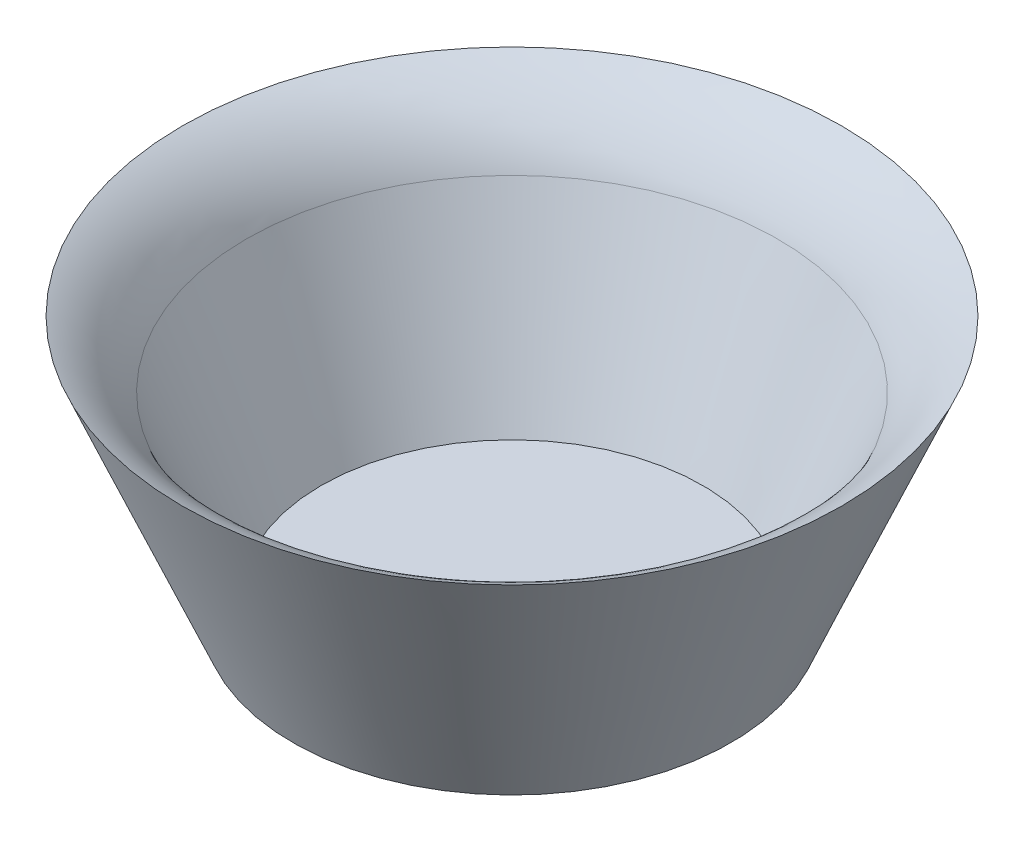
ISO-10303-21;
HEADER;
FILE_DESCRIPTION(('STEP AP214'),'2;1');
FILE_NAME('part.step','',(''),(''),'','','');
FILE_SCHEMA(('AUTOMOTIVE_DESIGN { 1 0 10303 214 1 1 1 1 }'));
ENDSEC;
DATA;
#1=APPLICATION_CONTEXT('core data for automotive mechanical design processes');
#2=APPLICATION_PROTOCOL_DEFINITION('international standard','automotive_design',2000,#1);
#3=PRODUCT_CONTEXT('',#1,'mechanical');
#4=PRODUCT('Part','Part','',(#3));
#5=PRODUCT_RELATED_PRODUCT_CATEGORY('part','',(#4));
#6=PRODUCT_DEFINITION_FORMATION('','',#4);
#7=PRODUCT_DEFINITION_CONTEXT('part definition',#1,'design');
#8=PRODUCT_DEFINITION('design','',#6,#7);
#9=PRODUCT_DEFINITION_SHAPE('','',#8);
#10=(LENGTH_UNIT() NAMED_UNIT(*) SI_UNIT(.MILLI.,.METRE.));
#11=(NAMED_UNIT(*) PLANE_ANGLE_UNIT() SI_UNIT($,.RADIAN.));
#12=(NAMED_UNIT(*) SI_UNIT($,.STERADIAN.) SOLID_ANGLE_UNIT());
#13=UNCERTAINTY_MEASURE_WITH_UNIT(LENGTH_MEASURE(1.E-05),#10,'distance_accuracy_value','');
#14=(GEOMETRIC_REPRESENTATION_CONTEXT(3) GLOBAL_UNCERTAINTY_ASSIGNED_CONTEXT((#13)) GLOBAL_UNIT_ASSIGNED_CONTEXT((#10,
#11,#12)) REPRESENTATION_CONTEXT('',''));
#15=CARTESIAN_POINT('',(0.,0.,0.));
#16=DIRECTION('',(0.,0.,1.));
#17=DIRECTION('',(1.,0.,0.));
#18=AXIS2_PLACEMENT_3D('',#15,#16,#17);
#19=CARTESIAN_POINT('',(-37.4243194035992,0.,0.));
#20=DIRECTION('',(0.,1.,0.));
#21=DIRECTION('',(-1.,0.,0.));
#22=AXIS2_PLACEMENT_3D('',#19,#20,#21);
#23=PLANE('',#22);
#24=CARTESIAN_POINT('',(0.,0.,0.));
#25=DIRECTION('',(0.,1.,0.));
#26=DIRECTION('',(-1.,0.,0.));
#27=AXIS2_PLACEMENT_3D('',#24,#25,#26);
#28=CIRCLE('',#27,37.4243194035992);
#29=CARTESIAN_POINT('',(-37.4243194035992,0.,0.));
#30=VERTEX_POINT('',#29);
#31=EDGE_CURVE('E55',#30,#30,#28,.T.);
#32=ORIENTED_EDGE('',*,*,#31,.T.);
#33=EDGE_LOOP('',(#32));
#34=FACE_BOUND('',#33,.T.);
#35=ADVANCED_FACE('F37',(#34),#23,.T.);
#36=CARTESIAN_POINT('',(0.,-3.5,0.));
#37=DIRECTION('',(0.,-1.,0.));
#38=DIRECTION('',(1.,0.,0.));
#39=AXIS2_PLACEMENT_3D('',#36,#37,#38);
#40=PLANE('',#39);
#41=CARTESIAN_POINT('',(0.,-3.5,0.));
#42=DIRECTION('',(0.,1.,0.));
#43=DIRECTION('',(-1.,0.,0.));
#44=AXIS2_PLACEMENT_3D('',#41,#42,#43);
#45=CIRCLE('',#44,43.);
#46=CARTESIAN_POINT('',(-43.,-3.5,0.));
#47=VERTEX_POINT('',#46);
#48=EDGE_CURVE('E45',#47,#47,#45,.T.);
#49=ORIENTED_EDGE('',*,*,#48,.F.);
#50=EDGE_LOOP('',(#49));
#51=FACE_BOUND('',#50,.T.);
#52=ADVANCED_FACE('F72',(#51),#40,.T.);
#53=CARTESIAN_POINT('',(0.,47.5,0.));
#54=DIRECTION('',(0.,1.,0.));
#55=DIRECTION('',(-1.,0.,0.));
#56=AXIS2_PLACEMENT_3D('',#53,#54,#55);
#57=CONICAL_SURFACE('',#56,64.6482156266897,0.401425727958693);
#58=ORIENTED_EDGE('',*,*,#48,.T.);
#59=EDGE_LOOP('',(#58));
#60=FACE_BOUND('',#59,.T.);
#61=CARTESIAN_POINT('',(0.,47.5,0.));
#62=DIRECTION('',(0.,1.,0.));
#63=DIRECTION('',(-1.,0.,0.));
#64=AXIS2_PLACEMENT_3D('',#61,#62,#63);
#65=CIRCLE('',#64,64.6482156266897);
#66=CARTESIAN_POINT('',(-64.6482156266897,47.5,0.));
#67=VERTEX_POINT('',#66);
#68=EDGE_CURVE('E50',#67,#67,#65,.T.);
#69=ORIENTED_EDGE('',*,*,#68,.F.);
#70=EDGE_LOOP('',(#69));
#71=FACE_BOUND('',#70,.T.);
#72=ADVANCED_FACE('F65',(#60,#71),#57,.T.);
#73=CARTESIAN_POINT('',(0.,0.,0.));
#74=DIRECTION('',(0.,1.,0.));
#75=DIRECTION('',(-1.,0.,0.));
#76=AXIS2_PLACEMENT_3D('',#73,#74,#75);
#77=CONICAL_SURFACE('',#76,37.4243194035992,0.401425727958693);
#78=CARTESIAN_POINT('',(0.,34.5613051545471,0.));
#79=DIRECTION('',(0.,1.,0.));
#80=DIRECTION('',(-1.,0.,0.));
#81=AXIS2_PLACEMENT_3D('',#78,#79,#80);
#82=CIRCLE('',#81,52.0947230570395);
#83=CARTESIAN_POINT('',(-52.0947230570395,34.5613051545471,0.));
#84=VERTEX_POINT('',#83);
#85=EDGE_CURVE('E10',#84,#84,#82,.T.);
#86=ORIENTED_EDGE('',*,*,#85,.T.);
#87=EDGE_LOOP('',(#86));
#88=FACE_BOUND('',#87,.T.);
#89=ORIENTED_EDGE('',*,*,#31,.F.);
#90=EDGE_LOOP('',(#89));
#91=FACE_BOUND('',#90,.T.);
#92=ADVANCED_FACE('F63',(#88,#91),#77,.F.);
#93=CARTESIAN_POINT('',(0.,24.7930269423153,0.));
#94=DIRECTION('',(0.,1.,0.));
#95=DIRECTION('',(-1.,0.,0.));
#96=AXIS2_PLACEMENT_3D('',#93,#94,#95);
#97=TOROIDAL_SURFACE('',#96,75.1073443933506,25.);
#98=ORIENTED_EDGE('',*,*,#68,.T.);
#99=EDGE_LOOP('',(#98));
#100=FACE_BOUND('',#99,.T.);
#101=ORIENTED_EDGE('',*,*,#85,.F.);
#102=EDGE_LOOP('',(#101));
#103=FACE_BOUND('',#102,.T.);
#104=ADVANCED_FACE('F39',(#100,#103),#97,.T.);
#105=CLOSED_SHELL('',(#35,#52,#72,#92,#104));
#106=MANIFOLD_SOLID_BREP('B2',#105);
#107=ADVANCED_BREP_SHAPE_REPRESENTATION('',(#18,#106),#14);
#108=SHAPE_DEFINITION_REPRESENTATION(#9,#107);
ENDSEC;
END-ISO-10303-21;
